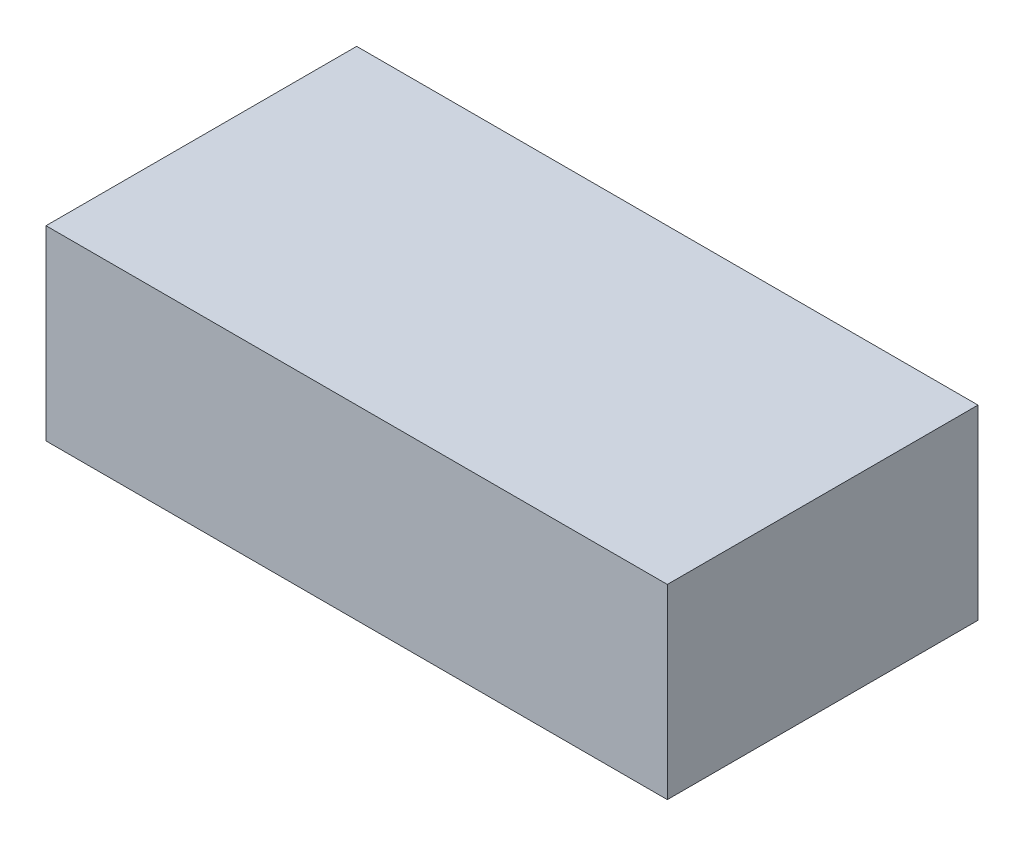
ISO-10303-21;
HEADER;
FILE_DESCRIPTION(('STEP AP214'),'2;1');
FILE_NAME('part.step','',(''),(''),'','','');
FILE_SCHEMA(('AUTOMOTIVE_DESIGN { 1 0 10303 214 1 1 1 1 }'));
ENDSEC;
DATA;
#1=APPLICATION_CONTEXT('core data for automotive mechanical design processes');
#2=APPLICATION_PROTOCOL_DEFINITION('international standard','automotive_design',2000,#1);
#3=PRODUCT_CONTEXT('',#1,'mechanical');
#4=PRODUCT('Part','Part','',(#3));
#5=PRODUCT_RELATED_PRODUCT_CATEGORY('part','',(#4));
#6=PRODUCT_DEFINITION_FORMATION('','',#4);
#7=PRODUCT_DEFINITION_CONTEXT('part definition',#1,'design');
#8=PRODUCT_DEFINITION('design','',#6,#7);
#9=PRODUCT_DEFINITION_SHAPE('','',#8);
#10=(LENGTH_UNIT() NAMED_UNIT(*) SI_UNIT(.MILLI.,.METRE.));
#11=(NAMED_UNIT(*) PLANE_ANGLE_UNIT() SI_UNIT($,.RADIAN.));
#12=(NAMED_UNIT(*) SI_UNIT($,.STERADIAN.) SOLID_ANGLE_UNIT());
#13=UNCERTAINTY_MEASURE_WITH_UNIT(LENGTH_MEASURE(1.E-05),#10,'distance_accuracy_value','');
#14=(GEOMETRIC_REPRESENTATION_CONTEXT(3) GLOBAL_UNCERTAINTY_ASSIGNED_CONTEXT((#13)) GLOBAL_UNIT_ASSIGNED_CONTEXT((#10,
#11,#12)) REPRESENTATION_CONTEXT('',''));
#15=CARTESIAN_POINT('',(0.,0.,0.));
#16=DIRECTION('',(0.,0.,1.));
#17=DIRECTION('',(1.,0.,0.));
#18=AXIS2_PLACEMENT_3D('',#15,#16,#17);
#19=CARTESIAN_POINT('',(50.,30.,25.));
#20=DIRECTION('',(-1.,0.,0.));
#21=DIRECTION('',(0.,0.,1.));
#22=AXIS2_PLACEMENT_3D('',#19,#20,#21);
#23=PLANE('',#22);
#24=DIRECTION('',(0.,0.,-1.));
#25=VECTOR('',#24,1.);
#26=CARTESIAN_POINT('',(50.,0.,25.));
#27=LINE('',#26,#25);
#28=CARTESIAN_POINT('',(50.,0.,25.));
#29=VERTEX_POINT('',#28);
#30=CARTESIAN_POINT('',(50.,0.,-25.));
#31=VERTEX_POINT('',#30);
#32=EDGE_CURVE('E96',#29,#31,#27,.T.);
#33=ORIENTED_EDGE('',*,*,#32,.T.);
#34=DIRECTION('',(0.,-1.,0.));
#35=VECTOR('',#34,1.);
#36=CARTESIAN_POINT('',(50.,30.,-25.));
#37=LINE('',#36,#35);
#38=CARTESIAN_POINT('',(50.,30.,-25.));
#39=VERTEX_POINT('',#38);
#40=EDGE_CURVE('E11',#39,#31,#37,.T.);
#41=ORIENTED_EDGE('',*,*,#40,.F.);
#42=DIRECTION('',(0.,0.,-1.));
#43=VECTOR('',#42,1.);
#44=CARTESIAN_POINT('',(50.,30.,25.));
#45=LINE('',#44,#43);
#46=CARTESIAN_POINT('',(50.,30.,25.));
#47=VERTEX_POINT('',#46);
#48=EDGE_CURVE('E84',#47,#39,#45,.T.);
#49=ORIENTED_EDGE('',*,*,#48,.F.);
#50=DIRECTION('',(0.,-1.,0.));
#51=VECTOR('',#50,1.);
#52=CARTESIAN_POINT('',(50.,30.,25.));
#53=LINE('',#52,#51);
#54=EDGE_CURVE('E92',#47,#29,#53,.T.);
#55=ORIENTED_EDGE('',*,*,#54,.T.);
#56=EDGE_LOOP('',(#33,#41,#49,#55));
#57=FACE_BOUND('',#56,.T.);
#58=ADVANCED_FACE('F33',(#57),#23,.F.);
#59=CARTESIAN_POINT('',(-50.,30.,-25.));
#60=DIRECTION('',(0.,0.,1.));
#61=DIRECTION('',(1.,0.,0.));
#62=AXIS2_PLACEMENT_3D('',#59,#60,#61);
#63=PLANE('',#62);
#64=DIRECTION('',(-1.,0.,0.));
#65=VECTOR('',#64,1.);
#66=CARTESIAN_POINT('',(-50.,0.,-25.));
#67=LINE('',#66,#65);
#68=CARTESIAN_POINT('',(-50.,0.,-25.));
#69=VERTEX_POINT('',#68);
#70=EDGE_CURVE('E88',#31,#69,#67,.T.);
#71=ORIENTED_EDGE('',*,*,#70,.T.);
#72=DIRECTION('',(0.,-1.,0.));
#73=VECTOR('',#72,1.);
#74=CARTESIAN_POINT('',(-50.,30.,-25.));
#75=LINE('',#74,#73);
#76=CARTESIAN_POINT('',(-50.,30.,-25.));
#77=VERTEX_POINT('',#76);
#78=EDGE_CURVE('E41',#77,#69,#75,.T.);
#79=ORIENTED_EDGE('',*,*,#78,.F.);
#80=DIRECTION('',(-1.,0.,0.));
#81=VECTOR('',#80,1.);
#82=CARTESIAN_POINT('',(-50.,30.,-25.));
#83=LINE('',#82,#81);
#84=EDGE_CURVE('E79',#39,#77,#83,.T.);
#85=ORIENTED_EDGE('',*,*,#84,.F.);
#86=ORIENTED_EDGE('',*,*,#40,.T.);
#87=EDGE_LOOP('',(#71,#79,#85,#86));
#88=FACE_BOUND('',#87,.T.);
#89=ADVANCED_FACE('F87',(#88),#63,.F.);
#90=CARTESIAN_POINT('',(-50.,30.,25.));
#91=DIRECTION('',(1.,0.,0.));
#92=DIRECTION('',(0.,0.,-1.));
#93=AXIS2_PLACEMENT_3D('',#90,#91,#92);
#94=PLANE('',#93);
#95=DIRECTION('',(0.,0.,1.));
#96=VECTOR('',#95,1.);
#97=CARTESIAN_POINT('',(-50.,0.,25.));
#98=LINE('',#97,#96);
#99=CARTESIAN_POINT('',(-50.,0.,25.));
#100=VERTEX_POINT('',#99);
#101=EDGE_CURVE('E66',#69,#100,#98,.T.);
#102=ORIENTED_EDGE('',*,*,#101,.T.);
#103=DIRECTION('',(0.,-1.,0.));
#104=VECTOR('',#103,1.);
#105=CARTESIAN_POINT('',(-50.,30.,25.));
#106=LINE('',#105,#104);
#107=CARTESIAN_POINT('',(-50.,30.,25.));
#108=VERTEX_POINT('',#107);
#109=EDGE_CURVE('E89',#108,#100,#106,.T.);
#110=ORIENTED_EDGE('',*,*,#109,.F.);
#111=DIRECTION('',(0.,0.,1.));
#112=VECTOR('',#111,1.);
#113=CARTESIAN_POINT('',(-50.,30.,25.));
#114=LINE('',#113,#112);
#115=EDGE_CURVE('E82',#77,#108,#114,.T.);
#116=ORIENTED_EDGE('',*,*,#115,.F.);
#117=ORIENTED_EDGE('',*,*,#78,.T.);
#118=EDGE_LOOP('',(#102,#110,#116,#117));
#119=FACE_BOUND('',#118,.T.);
#120=ADVANCED_FACE('F90',(#119),#94,.F.);
#121=CARTESIAN_POINT('',(-50.,30.,25.));
#122=DIRECTION('',(0.,0.,-1.));
#123=DIRECTION('',(-1.,0.,0.));
#124=AXIS2_PLACEMENT_3D('',#121,#122,#123);
#125=PLANE('',#124);
#126=DIRECTION('',(1.,0.,0.));
#127=VECTOR('',#126,1.);
#128=CARTESIAN_POINT('',(-50.,0.,25.));
#129=LINE('',#128,#127);
#130=EDGE_CURVE('E72',#100,#29,#129,.T.);
#131=ORIENTED_EDGE('',*,*,#130,.T.);
#132=ORIENTED_EDGE('',*,*,#54,.F.);
#133=DIRECTION('',(1.,0.,0.));
#134=VECTOR('',#133,1.);
#135=CARTESIAN_POINT('',(-50.,30.,25.));
#136=LINE('',#135,#134);
#137=EDGE_CURVE('E49',#108,#47,#136,.T.);
#138=ORIENTED_EDGE('',*,*,#137,.F.);
#139=ORIENTED_EDGE('',*,*,#109,.T.);
#140=EDGE_LOOP('',(#131,#132,#138,#139));
#141=FACE_BOUND('',#140,.T.);
#142=ADVANCED_FACE('F103',(#141),#125,.F.);
#143=CARTESIAN_POINT('',(0.,30.,0.));
#144=DIRECTION('',(0.,-1.,0.));
#145=DIRECTION('',(0.,0.,-1.));
#146=AXIS2_PLACEMENT_3D('',#143,#144,#145);
#147=PLANE('',#146);
#148=ORIENTED_EDGE('',*,*,#48,.T.);
#149=ORIENTED_EDGE('',*,*,#84,.T.);
#150=ORIENTED_EDGE('',*,*,#115,.T.);
#151=ORIENTED_EDGE('',*,*,#137,.T.);
#152=EDGE_LOOP('',(#148,#149,#150,#151));
#153=FACE_BOUND('',#152,.T.);
#154=ADVANCED_FACE('F80',(#153),#147,.F.);
#155=CARTESIAN_POINT('',(0.,0.,0.));
#156=DIRECTION('',(0.,-1.,0.));
#157=DIRECTION('',(0.,0.,-1.));
#158=AXIS2_PLACEMENT_3D('',#155,#156,#157);
#159=PLANE('',#158);
#160=ORIENTED_EDGE('',*,*,#32,.F.);
#161=ORIENTED_EDGE('',*,*,#130,.F.);
#162=ORIENTED_EDGE('',*,*,#101,.F.);
#163=ORIENTED_EDGE('',*,*,#70,.F.);
#164=EDGE_LOOP('',(#160,#161,#162,#163));
#165=FACE_BOUND('',#164,.T.);
#166=ADVANCED_FACE('F106',(#165),#159,.T.);
#167=CLOSED_SHELL('',(#58,#89,#120,#142,#154,#166));
#168=MANIFOLD_SOLID_BREP('B2',#167);
#169=ADVANCED_BREP_SHAPE_REPRESENTATION('',(#18,#168),#14);
#170=SHAPE_DEFINITION_REPRESENTATION(#9,#169);
ENDSEC;
END-ISO-10303-21;
